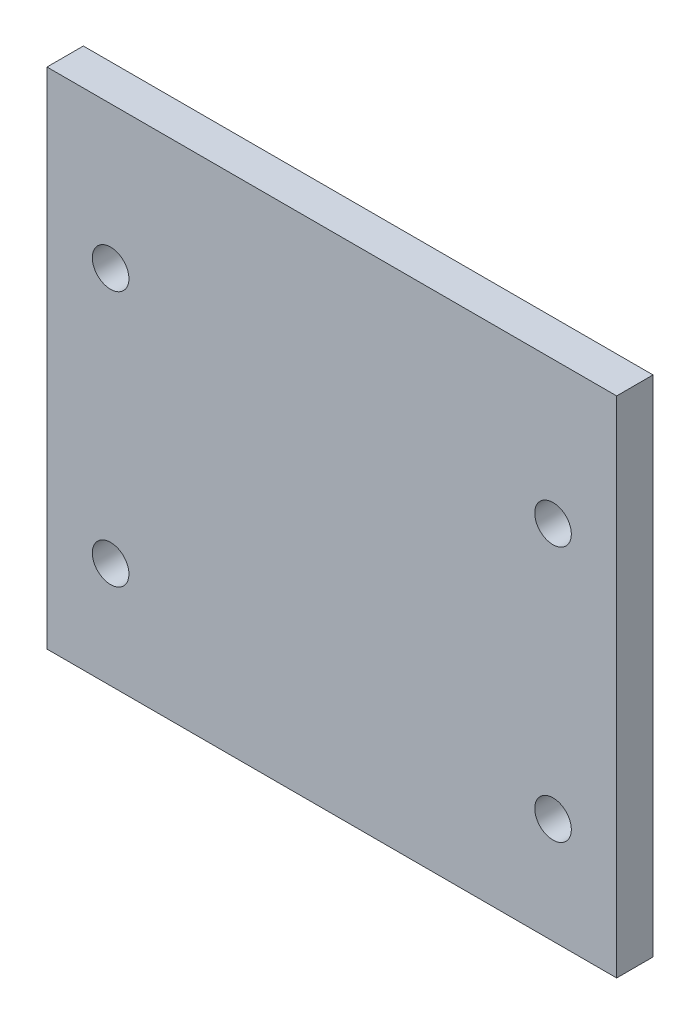
ISO-10303-21;
HEADER;
FILE_DESCRIPTION(('STEP AP214'),'2;1');
FILE_NAME('part.step','',(''),(''),'','','');
FILE_SCHEMA(('AUTOMOTIVE_DESIGN { 1 0 10303 214 1 1 1 1 }'));
ENDSEC;
DATA;
#1=APPLICATION_CONTEXT('core data for automotive mechanical design processes');
#2=APPLICATION_PROTOCOL_DEFINITION('international standard','automotive_design',2000,#1);
#3=PRODUCT_CONTEXT('',#1,'mechanical');
#4=PRODUCT('Part','Part','',(#3));
#5=PRODUCT_RELATED_PRODUCT_CATEGORY('part','',(#4));
#6=PRODUCT_DEFINITION_FORMATION('','',#4);
#7=PRODUCT_DEFINITION_CONTEXT('part definition',#1,'design');
#8=PRODUCT_DEFINITION('design','',#6,#7);
#9=PRODUCT_DEFINITION_SHAPE('','',#8);
#10=(LENGTH_UNIT() NAMED_UNIT(*) SI_UNIT(.MILLI.,.METRE.));
#11=(NAMED_UNIT(*) PLANE_ANGLE_UNIT() SI_UNIT($,.RADIAN.));
#12=(NAMED_UNIT(*) SI_UNIT($,.STERADIAN.) SOLID_ANGLE_UNIT());
#13=UNCERTAINTY_MEASURE_WITH_UNIT(LENGTH_MEASURE(1.E-05),#10,'distance_accuracy_value','');
#14=(GEOMETRIC_REPRESENTATION_CONTEXT(3) GLOBAL_UNCERTAINTY_ASSIGNED_CONTEXT((#13)) GLOBAL_UNIT_ASSIGNED_CONTEXT((#10,
#11,#12)) REPRESENTATION_CONTEXT('',''));
#15=CARTESIAN_POINT('',(0.,0.,0.));
#16=DIRECTION('',(0.,0.,1.));
#17=DIRECTION('',(1.,0.,0.));
#18=AXIS2_PLACEMENT_3D('',#15,#16,#17);
#19=CARTESIAN_POINT('',(0.,0.,3.));
#20=DIRECTION('',(0.,0.,-1.));
#21=DIRECTION('',(-1.,0.,0.));
#22=AXIS2_PLACEMENT_3D('',#19,#20,#21);
#23=PLANE('',#22);
#24=DIRECTION('',(0.,-1.,0.));
#25=VECTOR('',#24,1.);
#26=CARTESIAN_POINT('',(0.,0.,3.));
#27=LINE('',#26,#25);
#28=CARTESIAN_POINT('',(0.,41.59,3.));
#29=VERTEX_POINT('',#28);
#30=CARTESIAN_POINT('',(0.,0.,3.));
#31=VERTEX_POINT('',#30);
#32=EDGE_CURVE('E97',#29,#31,#27,.T.);
#33=ORIENTED_EDGE('',*,*,#32,.T.);
#34=DIRECTION('',(1.,0.,0.));
#35=VECTOR('',#34,1.);
#36=CARTESIAN_POINT('',(0.,0.,3.));
#37=LINE('',#36,#35);
#38=CARTESIAN_POINT('',(47.,0.,3.));
#39=VERTEX_POINT('',#38);
#40=EDGE_CURVE('E93',#31,#39,#37,.T.);
#41=ORIENTED_EDGE('',*,*,#40,.T.);
#42=DIRECTION('',(0.,1.,0.));
#43=VECTOR('',#42,1.);
#44=CARTESIAN_POINT('',(47.,0.,3.));
#45=LINE('',#44,#43);
#46=CARTESIAN_POINT('',(47.,41.59,3.));
#47=VERTEX_POINT('',#46);
#48=EDGE_CURVE('E96',#39,#47,#45,.T.);
#49=ORIENTED_EDGE('',*,*,#48,.T.);
#50=DIRECTION('',(-1.,0.,0.));
#51=VECTOR('',#50,1.);
#52=CARTESIAN_POINT('',(0.,41.59,3.));
#53=LINE('',#52,#51);
#54=EDGE_CURVE('E64',#47,#29,#53,.T.);
#55=ORIENTED_EDGE('',*,*,#54,.T.);
#56=EDGE_LOOP('',(#33,#41,#49,#55));
#57=FACE_BOUND('',#56,.T.);
#58=CARTESIAN_POINT('',(5.25,8.74,3.));
#59=DIRECTION('',(0.,0.,1.));
#60=DIRECTION('',(1.,0.,0.));
#61=AXIS2_PLACEMENT_3D('',#58,#59,#60);
#62=CIRCLE('',#61,1.51);
#63=CARTESIAN_POINT('',(6.76,8.74,3.));
#64=VERTEX_POINT('',#63);
#65=EDGE_CURVE('E119',#64,#64,#62,.T.);
#66=ORIENTED_EDGE('',*,*,#65,.F.);
#67=EDGE_LOOP('',(#66));
#68=FACE_BOUND('',#67,.T.);
#69=CARTESIAN_POINT('',(41.75,8.74,3.));
#70=DIRECTION('',(0.,0.,1.));
#71=DIRECTION('',(1.,0.,0.));
#72=AXIS2_PLACEMENT_3D('',#69,#70,#71);
#73=CIRCLE('',#72,1.51);
#74=CARTESIAN_POINT('',(43.26,8.74,3.));
#75=VERTEX_POINT('',#74);
#76=EDGE_CURVE('E139',#75,#75,#73,.T.);
#77=ORIENTED_EDGE('',*,*,#76,.F.);
#78=EDGE_LOOP('',(#77));
#79=FACE_BOUND('',#78,.T.);
#80=CARTESIAN_POINT('',(41.75,29.84,3.));
#81=DIRECTION('',(0.,0.,1.));
#82=DIRECTION('',(1.,0.,0.));
#83=AXIS2_PLACEMENT_3D('',#80,#81,#82);
#84=CIRCLE('',#83,1.51);
#85=CARTESIAN_POINT('',(43.26,29.84,3.));
#86=VERTEX_POINT('',#85);
#87=EDGE_CURVE('E149',#86,#86,#84,.T.);
#88=ORIENTED_EDGE('',*,*,#87,.F.);
#89=EDGE_LOOP('',(#88));
#90=FACE_BOUND('',#89,.T.);
#91=CARTESIAN_POINT('',(5.25,29.84,3.));
#92=DIRECTION('',(0.,0.,1.));
#93=DIRECTION('',(1.,0.,0.));
#94=AXIS2_PLACEMENT_3D('',#91,#92,#93);
#95=CIRCLE('',#94,1.51);
#96=CARTESIAN_POINT('',(6.76,29.84,3.));
#97=VERTEX_POINT('',#96);
#98=EDGE_CURVE('E157',#97,#97,#95,.T.);
#99=ORIENTED_EDGE('',*,*,#98,.F.);
#100=EDGE_LOOP('',(#99));
#101=FACE_BOUND('',#100,.T.);
#102=ADVANCED_FACE('F44',(#57,#68,#79,#90,#101),#23,.F.);
#103=CARTESIAN_POINT('',(0.,0.,0.));
#104=DIRECTION('',(0.,0.,-1.));
#105=DIRECTION('',(-1.,0.,0.));
#106=AXIS2_PLACEMENT_3D('',#103,#104,#105);
#107=PLANE('',#106);
#108=CARTESIAN_POINT('',(41.75,29.84,0.));
#109=DIRECTION('',(0.,0.,1.));
#110=DIRECTION('',(1.,0.,0.));
#111=AXIS2_PLACEMENT_3D('',#108,#109,#110);
#112=CIRCLE('',#111,1.51);
#113=CARTESIAN_POINT('',(43.26,29.84,0.));
#114=VERTEX_POINT('',#113);
#115=EDGE_CURVE('E152',#114,#114,#112,.T.);
#116=ORIENTED_EDGE('',*,*,#115,.T.);
#117=EDGE_LOOP('',(#116));
#118=FACE_BOUND('',#117,.T.);
#119=CARTESIAN_POINT('',(5.25,8.74,0.));
#120=DIRECTION('',(0.,0.,1.));
#121=DIRECTION('',(1.,0.,0.));
#122=AXIS2_PLACEMENT_3D('',#119,#120,#121);
#123=CIRCLE('',#122,1.51);
#124=CARTESIAN_POINT('',(6.76,8.74,0.));
#125=VERTEX_POINT('',#124);
#126=EDGE_CURVE('E136',#125,#125,#123,.T.);
#127=ORIENTED_EDGE('',*,*,#126,.T.);
#128=EDGE_LOOP('',(#127));
#129=FACE_BOUND('',#128,.T.);
#130=DIRECTION('',(0.,-1.,0.));
#131=VECTOR('',#130,1.);
#132=CARTESIAN_POINT('',(0.,0.,0.));
#133=LINE('',#132,#131);
#134=CARTESIAN_POINT('',(0.,41.59,0.));
#135=VERTEX_POINT('',#134);
#136=CARTESIAN_POINT('',(0.,0.,0.));
#137=VERTEX_POINT('',#136);
#138=EDGE_CURVE('E114',#135,#137,#133,.T.);
#139=ORIENTED_EDGE('',*,*,#138,.F.);
#140=DIRECTION('',(-1.,0.,0.));
#141=VECTOR('',#140,1.);
#142=CARTESIAN_POINT('',(0.,41.59,0.));
#143=LINE('',#142,#141);
#144=CARTESIAN_POINT('',(47.,41.59,0.));
#145=VERTEX_POINT('',#144);
#146=EDGE_CURVE('E86',#145,#135,#143,.T.);
#147=ORIENTED_EDGE('',*,*,#146,.F.);
#148=DIRECTION('',(0.,1.,0.));
#149=VECTOR('',#148,1.);
#150=CARTESIAN_POINT('',(47.,0.,0.));
#151=LINE('',#150,#149);
#152=CARTESIAN_POINT('',(47.,0.,0.));
#153=VERTEX_POINT('',#152);
#154=EDGE_CURVE('E79',#153,#145,#151,.T.);
#155=ORIENTED_EDGE('',*,*,#154,.F.);
#156=DIRECTION('',(1.,0.,0.));
#157=VECTOR('',#156,1.);
#158=CARTESIAN_POINT('',(0.,0.,0.));
#159=LINE('',#158,#157);
#160=EDGE_CURVE('E104',#137,#153,#159,.T.);
#161=ORIENTED_EDGE('',*,*,#160,.F.);
#162=EDGE_LOOP('',(#139,#147,#155,#161));
#163=FACE_BOUND('',#162,.T.);
#164=CARTESIAN_POINT('',(41.75,8.74,0.));
#165=DIRECTION('',(0.,0.,1.));
#166=DIRECTION('',(1.,0.,0.));
#167=AXIS2_PLACEMENT_3D('',#164,#165,#166);
#168=CIRCLE('',#167,1.51);
#169=CARTESIAN_POINT('',(43.26,8.74,0.));
#170=VERTEX_POINT('',#169);
#171=EDGE_CURVE('E143',#170,#170,#168,.T.);
#172=ORIENTED_EDGE('',*,*,#171,.T.);
#173=EDGE_LOOP('',(#172));
#174=FACE_BOUND('',#173,.T.);
#175=CARTESIAN_POINT('',(5.25,29.84,0.));
#176=DIRECTION('',(0.,0.,1.));
#177=DIRECTION('',(1.,0.,0.));
#178=AXIS2_PLACEMENT_3D('',#175,#176,#177);
#179=CIRCLE('',#178,1.51);
#180=CARTESIAN_POINT('',(6.76,29.84,0.));
#181=VERTEX_POINT('',#180);
#182=EDGE_CURVE('E158',#181,#181,#179,.T.);
#183=ORIENTED_EDGE('',*,*,#182,.T.);
#184=EDGE_LOOP('',(#183));
#185=FACE_BOUND('',#184,.T.);
#186=ADVANCED_FACE('F131',(#118,#129,#163,#174,#185),#107,.T.);
#187=CARTESIAN_POINT('',(0.,0.,3.));
#188=DIRECTION('',(1.,0.,0.));
#189=DIRECTION('',(0.,0.,-1.));
#190=AXIS2_PLACEMENT_3D('',#187,#188,#189);
#191=PLANE('',#190);
#192=ORIENTED_EDGE('',*,*,#138,.T.);
#193=DIRECTION('',(0.,0.,-1.));
#194=VECTOR('',#193,1.);
#195=CARTESIAN_POINT('',(0.,0.,3.));
#196=LINE('',#195,#194);
#197=EDGE_CURVE('E11',#31,#137,#196,.T.);
#198=ORIENTED_EDGE('',*,*,#197,.F.);
#199=ORIENTED_EDGE('',*,*,#32,.F.);
#200=DIRECTION('',(0.,0.,-1.));
#201=VECTOR('',#200,1.);
#202=CARTESIAN_POINT('',(0.,41.59,3.));
#203=LINE('',#202,#201);
#204=EDGE_CURVE('E110',#29,#135,#203,.T.);
#205=ORIENTED_EDGE('',*,*,#204,.T.);
#206=EDGE_LOOP('',(#192,#198,#199,#205));
#207=FACE_BOUND('',#206,.T.);
#208=ADVANCED_FACE('F50',(#207),#191,.F.);
#209=CARTESIAN_POINT('',(0.,0.,3.));
#210=DIRECTION('',(0.,1.,0.));
#211=DIRECTION('',(0.,0.,1.));
#212=AXIS2_PLACEMENT_3D('',#209,#210,#211);
#213=PLANE('',#212);
#214=ORIENTED_EDGE('',*,*,#160,.T.);
#215=DIRECTION('',(0.,0.,-1.));
#216=VECTOR('',#215,1.);
#217=CARTESIAN_POINT('',(47.,0.,3.));
#218=LINE('',#217,#216);
#219=EDGE_CURVE('E54',#39,#153,#218,.T.);
#220=ORIENTED_EDGE('',*,*,#219,.F.);
#221=ORIENTED_EDGE('',*,*,#40,.F.);
#222=ORIENTED_EDGE('',*,*,#197,.T.);
#223=EDGE_LOOP('',(#214,#220,#221,#222));
#224=FACE_BOUND('',#223,.T.);
#225=ADVANCED_FACE('F105',(#224),#213,.F.);
#226=CARTESIAN_POINT('',(47.,0.,3.));
#227=DIRECTION('',(-1.,0.,0.));
#228=DIRECTION('',(0.,0.,1.));
#229=AXIS2_PLACEMENT_3D('',#226,#227,#228);
#230=PLANE('',#229);
#231=ORIENTED_EDGE('',*,*,#154,.T.);
#232=DIRECTION('',(0.,0.,-1.));
#233=VECTOR('',#232,1.);
#234=CARTESIAN_POINT('',(47.,41.59,3.));
#235=LINE('',#234,#233);
#236=EDGE_CURVE('E103',#47,#145,#235,.T.);
#237=ORIENTED_EDGE('',*,*,#236,.F.);
#238=ORIENTED_EDGE('',*,*,#48,.F.);
#239=ORIENTED_EDGE('',*,*,#219,.T.);
#240=EDGE_LOOP('',(#231,#237,#238,#239));
#241=FACE_BOUND('',#240,.T.);
#242=ADVANCED_FACE('F106',(#241),#230,.F.);
#243=CARTESIAN_POINT('',(0.,41.59,3.));
#244=DIRECTION('',(0.,-1.,0.));
#245=DIRECTION('',(0.,0.,-1.));
#246=AXIS2_PLACEMENT_3D('',#243,#244,#245);
#247=PLANE('',#246);
#248=ORIENTED_EDGE('',*,*,#146,.T.);
#249=ORIENTED_EDGE('',*,*,#204,.F.);
#250=ORIENTED_EDGE('',*,*,#54,.F.);
#251=ORIENTED_EDGE('',*,*,#236,.T.);
#252=EDGE_LOOP('',(#248,#249,#250,#251));
#253=FACE_BOUND('',#252,.T.);
#254=ADVANCED_FACE('F126',(#253),#247,.F.);
#255=CARTESIAN_POINT('',(5.25,8.74,3.));
#256=DIRECTION('',(0.,0.,-1.));
#257=DIRECTION('',(-1.,0.,0.));
#258=AXIS2_PLACEMENT_3D('',#255,#256,#257);
#259=CYLINDRICAL_SURFACE('',#258,1.51);
#260=ORIENTED_EDGE('',*,*,#65,.T.);
#261=EDGE_LOOP('',(#260));
#262=FACE_BOUND('',#261,.T.);
#263=ORIENTED_EDGE('',*,*,#126,.F.);
#264=EDGE_LOOP('',(#263));
#265=FACE_BOUND('',#264,.T.);
#266=ADVANCED_FACE('F177',(#262,#265),#259,.F.);
#267=CARTESIAN_POINT('',(41.75,8.74,3.));
#268=DIRECTION('',(0.,0.,-1.));
#269=DIRECTION('',(-1.,0.,0.));
#270=AXIS2_PLACEMENT_3D('',#267,#268,#269);
#271=CYLINDRICAL_SURFACE('',#270,1.51);
#272=ORIENTED_EDGE('',*,*,#76,.T.);
#273=EDGE_LOOP('',(#272));
#274=FACE_BOUND('',#273,.T.);
#275=ORIENTED_EDGE('',*,*,#171,.F.);
#276=EDGE_LOOP('',(#275));
#277=FACE_BOUND('',#276,.T.);
#278=ADVANCED_FACE('F222',(#274,#277),#271,.F.);
#279=CARTESIAN_POINT('',(41.75,29.84,3.));
#280=DIRECTION('',(0.,0.,-1.));
#281=DIRECTION('',(-1.,0.,0.));
#282=AXIS2_PLACEMENT_3D('',#279,#280,#281);
#283=CYLINDRICAL_SURFACE('',#282,1.51);
#284=ORIENTED_EDGE('',*,*,#87,.T.);
#285=EDGE_LOOP('',(#284));
#286=FACE_BOUND('',#285,.T.);
#287=ORIENTED_EDGE('',*,*,#115,.F.);
#288=EDGE_LOOP('',(#287));
#289=FACE_BOUND('',#288,.T.);
#290=ADVANCED_FACE('F235',(#286,#289),#283,.F.);
#291=CARTESIAN_POINT('',(5.25,29.84,3.));
#292=DIRECTION('',(0.,0.,-1.));
#293=DIRECTION('',(-1.,0.,0.));
#294=AXIS2_PLACEMENT_3D('',#291,#292,#293);
#295=CYLINDRICAL_SURFACE('',#294,1.51);
#296=ORIENTED_EDGE('',*,*,#98,.T.);
#297=EDGE_LOOP('',(#296));
#298=FACE_BOUND('',#297,.T.);
#299=ORIENTED_EDGE('',*,*,#182,.F.);
#300=EDGE_LOOP('',(#299));
#301=FACE_BOUND('',#300,.T.);
#302=ADVANCED_FACE('F166',(#298,#301),#295,.F.);
#303=CLOSED_SHELL('',(#102,#186,#208,#225,#242,#254,#266,#278,#290,#302));
#304=MANIFOLD_SOLID_BREP('B2',#303);
#305=ADVANCED_BREP_SHAPE_REPRESENTATION('',(#18,#304),#14);
#306=SHAPE_DEFINITION_REPRESENTATION(#9,#305);
ENDSEC;
END-ISO-10303-21;
